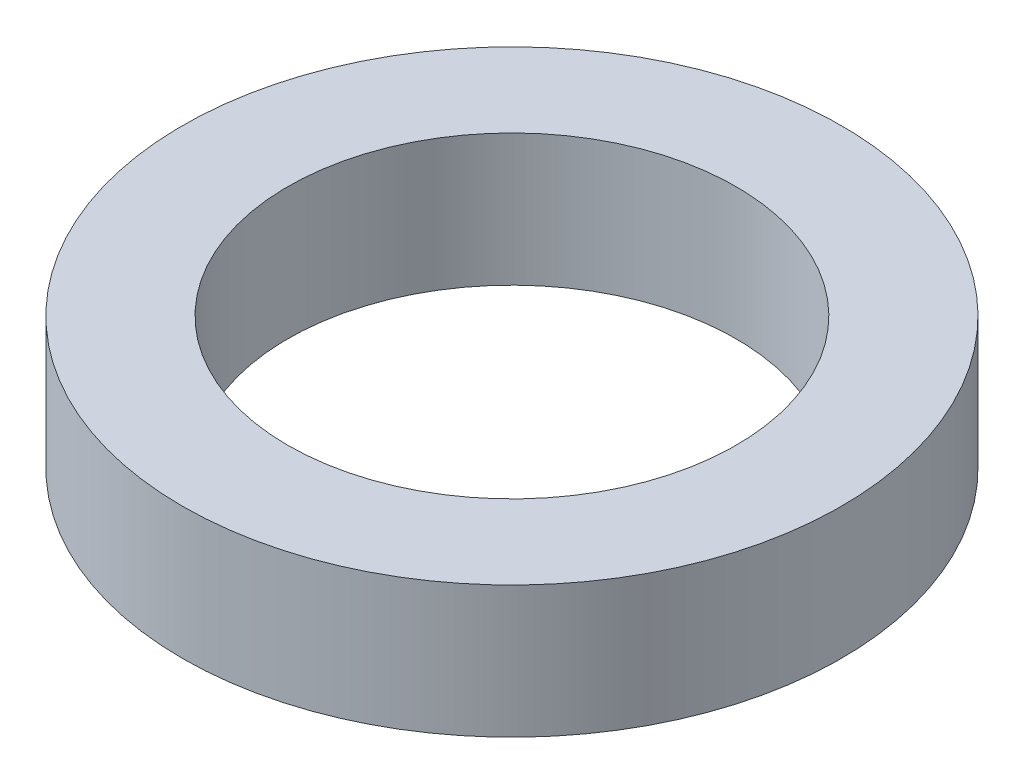
ISO-10303-21;
HEADER;
FILE_DESCRIPTION(('STEP AP214'),'2;1');
FILE_NAME('part.step','',(''),(''),'','','');
FILE_SCHEMA(('AUTOMOTIVE_DESIGN { 1 0 10303 214 1 1 1 1 }'));
ENDSEC;
DATA;
#1=APPLICATION_CONTEXT('core data for automotive mechanical design processes');
#2=APPLICATION_PROTOCOL_DEFINITION('international standard','automotive_design',2000,#1);
#3=PRODUCT_CONTEXT('',#1,'mechanical');
#4=PRODUCT('Part','Part','',(#3));
#5=PRODUCT_RELATED_PRODUCT_CATEGORY('part','',(#4));
#6=PRODUCT_DEFINITION_FORMATION('','',#4);
#7=PRODUCT_DEFINITION_CONTEXT('part definition',#1,'design');
#8=PRODUCT_DEFINITION('design','',#6,#7);
#9=PRODUCT_DEFINITION_SHAPE('','',#8);
#10=(LENGTH_UNIT() NAMED_UNIT(*) SI_UNIT(.MILLI.,.METRE.));
#11=(NAMED_UNIT(*) PLANE_ANGLE_UNIT() SI_UNIT($,.RADIAN.));
#12=(NAMED_UNIT(*) SI_UNIT($,.STERADIAN.) SOLID_ANGLE_UNIT());
#13=UNCERTAINTY_MEASURE_WITH_UNIT(LENGTH_MEASURE(1.E-05),#10,'distance_accuracy_value','');
#14=(GEOMETRIC_REPRESENTATION_CONTEXT(3) GLOBAL_UNCERTAINTY_ASSIGNED_CONTEXT((#13)) GLOBAL_UNIT_ASSIGNED_CONTEXT((#10,
#11,#12)) REPRESENTATION_CONTEXT('',''));
#15=CARTESIAN_POINT('',(0.,0.,0.));
#16=DIRECTION('',(0.,0.,1.));
#17=DIRECTION('',(1.,0.,0.));
#18=AXIS2_PLACEMENT_3D('',#15,#16,#17);
#19=CARTESIAN_POINT('',(0.,5.,0.));
#20=DIRECTION('',(0.,1.,0.));
#21=DIRECTION('',(0.,0.,1.));
#22=AXIS2_PLACEMENT_3D('',#19,#20,#21);
#23=PLANE('',#22);
#24=CARTESIAN_POINT('',(0.,5.,0.));
#25=DIRECTION('',(0.,1.,0.));
#26=DIRECTION('',(0.,0.,1.));
#27=AXIS2_PLACEMENT_3D('',#24,#25,#26);
#28=CIRCLE('',#27,12.5);
#29=CARTESIAN_POINT('',(0.,5.,12.5));
#30=VERTEX_POINT('',#29);
#31=EDGE_CURVE('E10',#30,#30,#28,.T.);
#32=ORIENTED_EDGE('',*,*,#31,.T.);
#33=EDGE_LOOP('',(#32));
#34=FACE_BOUND('',#33,.T.);
#35=CARTESIAN_POINT('',(0.,5.,0.));
#36=DIRECTION('',(0.,1.,0.));
#37=DIRECTION('',(0.,0.,1.));
#38=AXIS2_PLACEMENT_3D('',#35,#36,#37);
#39=CIRCLE('',#38,8.5);
#40=CARTESIAN_POINT('',(0.,5.,8.5));
#41=VERTEX_POINT('',#40);
#42=EDGE_CURVE('E41',#41,#41,#39,.T.);
#43=ORIENTED_EDGE('',*,*,#42,.F.);
#44=EDGE_LOOP('',(#43));
#45=FACE_BOUND('',#44,.T.);
#46=ADVANCED_FACE('F30',(#34,#45),#23,.T.);
#47=CARTESIAN_POINT('',(0.,0.,0.));
#48=DIRECTION('',(0.,1.,0.));
#49=DIRECTION('',(0.,0.,1.));
#50=AXIS2_PLACEMENT_3D('',#47,#48,#49);
#51=PLANE('',#50);
#52=CARTESIAN_POINT('',(0.,0.,0.));
#53=DIRECTION('',(0.,1.,0.));
#54=DIRECTION('',(0.,0.,1.));
#55=AXIS2_PLACEMENT_3D('',#52,#53,#54);
#56=CIRCLE('',#55,12.5);
#57=CARTESIAN_POINT('',(0.,0.,12.5));
#58=VERTEX_POINT('',#57);
#59=EDGE_CURVE('E34',#58,#58,#56,.T.);
#60=ORIENTED_EDGE('',*,*,#59,.F.);
#61=EDGE_LOOP('',(#60));
#62=FACE_BOUND('',#61,.T.);
#63=CARTESIAN_POINT('',(0.,0.,0.));
#64=DIRECTION('',(0.,1.,0.));
#65=DIRECTION('',(0.,0.,1.));
#66=AXIS2_PLACEMENT_3D('',#63,#64,#65);
#67=CIRCLE('',#66,8.5);
#68=CARTESIAN_POINT('',(0.,0.,8.5));
#69=VERTEX_POINT('',#68);
#70=EDGE_CURVE('E43',#69,#69,#67,.T.);
#71=ORIENTED_EDGE('',*,*,#70,.T.);
#72=EDGE_LOOP('',(#71));
#73=FACE_BOUND('',#72,.T.);
#74=ADVANCED_FACE('F53',(#62,#73),#51,.F.);
#75=CARTESIAN_POINT('',(0.,5.,0.));
#76=DIRECTION('',(0.,-1.,0.));
#77=DIRECTION('',(0.,0.,-1.));
#78=AXIS2_PLACEMENT_3D('',#75,#76,#77);
#79=CYLINDRICAL_SURFACE('',#78,12.5);
#80=ORIENTED_EDGE('',*,*,#31,.F.);
#81=EDGE_LOOP('',(#80));
#82=FACE_BOUND('',#81,.T.);
#83=ORIENTED_EDGE('',*,*,#59,.T.);
#84=EDGE_LOOP('',(#83));
#85=FACE_BOUND('',#84,.T.);
#86=ADVANCED_FACE('F32',(#82,#85),#79,.T.);
#87=CARTESIAN_POINT('',(0.,5.,0.));
#88=DIRECTION('',(0.,-1.,0.));
#89=DIRECTION('',(0.,0.,-1.));
#90=AXIS2_PLACEMENT_3D('',#87,#88,#89);
#91=CYLINDRICAL_SURFACE('',#90,8.5);
#92=ORIENTED_EDGE('',*,*,#42,.T.);
#93=EDGE_LOOP('',(#92));
#94=FACE_BOUND('',#93,.T.);
#95=ORIENTED_EDGE('',*,*,#70,.F.);
#96=EDGE_LOOP('',(#95));
#97=FACE_BOUND('',#96,.T.);
#98=ADVANCED_FACE('F49',(#94,#97),#91,.F.);
#99=CLOSED_SHELL('',(#46,#74,#86,#98));
#100=MANIFOLD_SOLID_BREP('B2',#99);
#101=ADVANCED_BREP_SHAPE_REPRESENTATION('',(#18,#100),#14);
#102=SHAPE_DEFINITION_REPRESENTATION(#9,#101);
ENDSEC;
END-ISO-10303-21;
